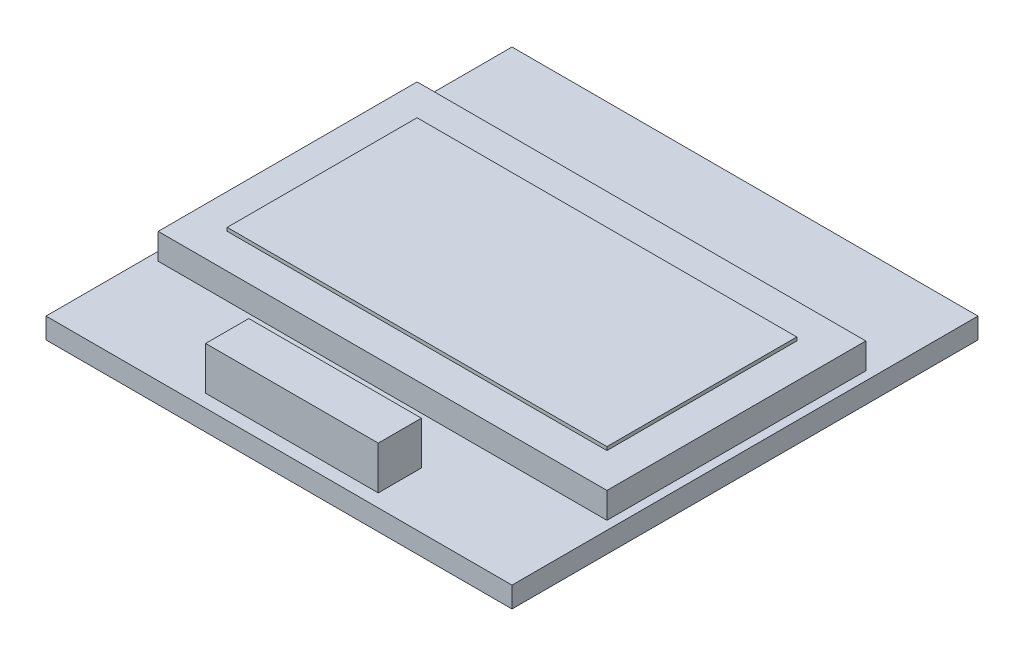
ISO-10303-21;
HEADER;
FILE_DESCRIPTION(('STEP AP214'),'2;1');
FILE_NAME('part.step','',(''),(''),'','','');
FILE_SCHEMA(('AUTOMOTIVE_DESIGN { 1 0 10303 214 1 1 1 1 }'));
ENDSEC;
DATA;
#1=APPLICATION_CONTEXT('core data for automotive mechanical design processes');
#2=APPLICATION_PROTOCOL_DEFINITION('international standard','automotive_design',2000,#1);
#3=PRODUCT_CONTEXT('',#1,'mechanical');
#4=PRODUCT('Part','Part','',(#3));
#5=PRODUCT_RELATED_PRODUCT_CATEGORY('part','',(#4));
#6=PRODUCT_DEFINITION_FORMATION('','',#4);
#7=PRODUCT_DEFINITION_CONTEXT('part definition',#1,'design');
#8=PRODUCT_DEFINITION('design','',#6,#7);
#9=PRODUCT_DEFINITION_SHAPE('','',#8);
#10=(LENGTH_UNIT() NAMED_UNIT(*) SI_UNIT(.MILLI.,.METRE.));
#11=(NAMED_UNIT(*) PLANE_ANGLE_UNIT() SI_UNIT($,.RADIAN.));
#12=(NAMED_UNIT(*) SI_UNIT($,.STERADIAN.) SOLID_ANGLE_UNIT());
#13=UNCERTAINTY_MEASURE_WITH_UNIT(LENGTH_MEASURE(1.E-05),#10,'distance_accuracy_value','');
#14=(GEOMETRIC_REPRESENTATION_CONTEXT(3) GLOBAL_UNCERTAINTY_ASSIGNED_CONTEXT((#13)) GLOBAL_UNIT_ASSIGNED_CONTEXT((#10,
#11,#12)) REPRESENTATION_CONTEXT('',''));
#15=CARTESIAN_POINT('',(0.,0.,0.));
#16=DIRECTION('',(0.,0.,1.));
#17=DIRECTION('',(1.,0.,0.));
#18=AXIS2_PLACEMENT_3D('',#15,#16,#17);
#19=CARTESIAN_POINT('',(0.,1.2,0.));
#20=DIRECTION('',(0.,-1.,0.));
#21=DIRECTION('',(0.,0.,-1.));
#22=AXIS2_PLACEMENT_3D('',#19,#20,#21);
#23=PLANE('',#22);
#24=DIRECTION('',(0.,0.,-1.));
#25=VECTOR('',#24,1.);
#26=CARTESIAN_POINT('',(13.,1.2,7.5));
#27=LINE('',#26,#25);
#28=CARTESIAN_POINT('',(13.,1.2,7.5));
#29=VERTEX_POINT('',#28);
#30=CARTESIAN_POINT('',(13.,1.2,-7.5));
#31=VERTEX_POINT('',#30);
#32=EDGE_CURVE('E236',#29,#31,#27,.T.);
#33=ORIENTED_EDGE('',*,*,#32,.F.);
#34=DIRECTION('',(1.,0.,0.));
#35=VECTOR('',#34,1.);
#36=CARTESIAN_POINT('',(-13.,1.2,7.5));
#37=LINE('',#36,#35);
#38=CARTESIAN_POINT('',(-13.,1.2,7.5));
#39=VERTEX_POINT('',#38);
#40=EDGE_CURVE('E245',#39,#29,#37,.T.);
#41=ORIENTED_EDGE('',*,*,#40,.F.);
#42=DIRECTION('',(0.,0.,1.));
#43=VECTOR('',#42,1.);
#44=CARTESIAN_POINT('',(-13.,1.2,7.5));
#45=LINE('',#44,#43);
#46=CARTESIAN_POINT('',(-13.,1.2,-7.5));
#47=VERTEX_POINT('',#46);
#48=EDGE_CURVE('E261',#47,#39,#45,.T.);
#49=ORIENTED_EDGE('',*,*,#48,.F.);
#50=DIRECTION('',(-1.,0.,0.));
#51=VECTOR('',#50,1.);
#52=CARTESIAN_POINT('',(-13.,1.2,-7.5));
#53=LINE('',#52,#51);
#54=EDGE_CURVE('E260',#31,#47,#53,.T.);
#55=ORIENTED_EDGE('',*,*,#54,.F.);
#56=EDGE_LOOP('',(#33,#41,#49,#55));
#57=FACE_BOUND('',#56,.T.);
#58=DIRECTION('',(0.,0.,-1.));
#59=VECTOR('',#58,1.);
#60=CARTESIAN_POINT('',(13.5,1.2,13.5));
#61=LINE('',#60,#59);
#62=CARTESIAN_POINT('',(13.5,1.2,13.5));
#63=VERTEX_POINT('',#62);
#64=CARTESIAN_POINT('',(13.5,1.2,-13.5));
#65=VERTEX_POINT('',#64);
#66=EDGE_CURVE('E285',#63,#65,#61,.T.);
#67=ORIENTED_EDGE('',*,*,#66,.T.);
#68=DIRECTION('',(-1.,0.,0.));
#69=VECTOR('',#68,1.);
#70=CARTESIAN_POINT('',(-13.5,1.2,-13.5));
#71=LINE('',#70,#69);
#72=CARTESIAN_POINT('',(-13.5,1.2,-13.5));
#73=VERTEX_POINT('',#72);
#74=EDGE_CURVE('E289',#65,#73,#71,.T.);
#75=ORIENTED_EDGE('',*,*,#74,.T.);
#76=DIRECTION('',(0.,0.,1.));
#77=VECTOR('',#76,1.);
#78=CARTESIAN_POINT('',(-13.5,1.2,13.5));
#79=LINE('',#78,#77);
#80=CARTESIAN_POINT('',(-13.5,1.2,13.5));
#81=VERTEX_POINT('',#80);
#82=EDGE_CURVE('E295',#73,#81,#79,.T.);
#83=ORIENTED_EDGE('',*,*,#82,.T.);
#84=DIRECTION('',(1.,0.,0.));
#85=VECTOR('',#84,1.);
#86=CARTESIAN_POINT('',(-13.5,1.2,13.5));
#87=LINE('',#86,#85);
#88=EDGE_CURVE('E293',#81,#63,#87,.T.);
#89=ORIENTED_EDGE('',*,*,#88,.T.);
#90=EDGE_LOOP('',(#67,#75,#83,#89));
#91=FACE_BOUND('',#90,.T.);
#92=DIRECTION('',(0.,0.,-1.));
#93=VECTOR('',#92,1.);
#94=CARTESIAN_POINT('',(5.,1.2,12.75));
#95=LINE('',#94,#93);
#96=CARTESIAN_POINT('',(5.,1.2,12.75));
#97=VERTEX_POINT('',#96);
#98=CARTESIAN_POINT('',(5.,1.2,10.25));
#99=VERTEX_POINT('',#98);
#100=EDGE_CURVE('E183',#97,#99,#95,.T.);
#101=ORIENTED_EDGE('',*,*,#100,.F.);
#102=DIRECTION('',(1.,0.,0.));
#103=VECTOR('',#102,1.);
#104=CARTESIAN_POINT('',(-5.,1.2,12.75));
#105=LINE('',#104,#103);
#106=CARTESIAN_POINT('',(-5.,1.2,12.75));
#107=VERTEX_POINT('',#106);
#108=EDGE_CURVE('E185',#107,#97,#105,.T.);
#109=ORIENTED_EDGE('',*,*,#108,.F.);
#110=DIRECTION('',(0.,0.,1.));
#111=VECTOR('',#110,1.);
#112=CARTESIAN_POINT('',(-5.,1.2,12.75));
#113=LINE('',#112,#111);
#114=CARTESIAN_POINT('',(-5.,1.2,10.25));
#115=VERTEX_POINT('',#114);
#116=EDGE_CURVE('E68',#115,#107,#113,.T.);
#117=ORIENTED_EDGE('',*,*,#116,.F.);
#118=DIRECTION('',(-1.,0.,0.));
#119=VECTOR('',#118,1.);
#120=CARTESIAN_POINT('',(-5.,1.2,10.25));
#121=LINE('',#120,#119);
#122=EDGE_CURVE('E61',#99,#115,#121,.T.);
#123=ORIENTED_EDGE('',*,*,#122,.F.);
#124=EDGE_LOOP('',(#101,#109,#117,#123));
#125=FACE_BOUND('',#124,.T.);
#126=ADVANCED_FACE('F47',(#57,#91,#125),#23,.F.);
#127=CARTESIAN_POINT('',(0.,2.7,0.));
#128=DIRECTION('',(0.,-1.,0.));
#129=DIRECTION('',(0.,0.,-1.));
#130=AXIS2_PLACEMENT_3D('',#127,#128,#129);
#131=PLANE('',#130);
#132=DIRECTION('',(0.,0.,-1.));
#133=VECTOR('',#132,1.);
#134=CARTESIAN_POINT('',(13.,2.7,7.5));
#135=LINE('',#134,#133);
#136=CARTESIAN_POINT('',(13.,2.7,7.5));
#137=VERTEX_POINT('',#136);
#138=CARTESIAN_POINT('',(13.,2.7,-7.5));
#139=VERTEX_POINT('',#138);
#140=EDGE_CURVE('E239',#137,#139,#135,.T.);
#141=ORIENTED_EDGE('',*,*,#140,.T.);
#142=DIRECTION('',(-1.,0.,0.));
#143=VECTOR('',#142,1.);
#144=CARTESIAN_POINT('',(-13.,2.7,-7.5));
#145=LINE('',#144,#143);
#146=CARTESIAN_POINT('',(-13.,2.7,-7.5));
#147=VERTEX_POINT('',#146);
#148=EDGE_CURVE('E242',#139,#147,#145,.T.);
#149=ORIENTED_EDGE('',*,*,#148,.T.);
#150=DIRECTION('',(0.,0.,1.));
#151=VECTOR('',#150,1.);
#152=CARTESIAN_POINT('',(-13.,2.7,7.5));
#153=LINE('',#152,#151);
#154=CARTESIAN_POINT('',(-13.,2.7,7.5));
#155=VERTEX_POINT('',#154);
#156=EDGE_CURVE('E250',#147,#155,#153,.T.);
#157=ORIENTED_EDGE('',*,*,#156,.T.);
#158=DIRECTION('',(1.,0.,0.));
#159=VECTOR('',#158,1.);
#160=CARTESIAN_POINT('',(-13.,2.7,7.5));
#161=LINE('',#160,#159);
#162=EDGE_CURVE('E248',#155,#137,#161,.T.);
#163=ORIENTED_EDGE('',*,*,#162,.T.);
#164=EDGE_LOOP('',(#141,#149,#157,#163));
#165=FACE_BOUND('',#164,.T.);
#166=DIRECTION('',(0.,0.,-1.));
#167=VECTOR('',#166,1.);
#168=CARTESIAN_POINT('',(11.,2.7,5.5));
#169=LINE('',#168,#167);
#170=CARTESIAN_POINT('',(11.,2.7,5.5));
#171=VERTEX_POINT('',#170);
#172=CARTESIAN_POINT('',(11.,2.7,-5.5));
#173=VERTEX_POINT('',#172);
#174=EDGE_CURVE('E189',#171,#173,#169,.T.);
#175=ORIENTED_EDGE('',*,*,#174,.F.);
#176=DIRECTION('',(1.,0.,0.));
#177=VECTOR('',#176,1.);
#178=CARTESIAN_POINT('',(-11.,2.7,5.5));
#179=LINE('',#178,#177);
#180=CARTESIAN_POINT('',(-11.,2.7,5.5));
#181=VERTEX_POINT('',#180);
#182=EDGE_CURVE('E201',#181,#171,#179,.T.);
#183=ORIENTED_EDGE('',*,*,#182,.F.);
#184=DIRECTION('',(0.,0.,1.));
#185=VECTOR('',#184,1.);
#186=CARTESIAN_POINT('',(-11.,2.7,5.5));
#187=LINE('',#186,#185);
#188=CARTESIAN_POINT('',(-11.,2.7,-5.5));
#189=VERTEX_POINT('',#188);
#190=EDGE_CURVE('E216',#189,#181,#187,.T.);
#191=ORIENTED_EDGE('',*,*,#190,.F.);
#192=DIRECTION('',(-1.,0.,0.));
#193=VECTOR('',#192,1.);
#194=CARTESIAN_POINT('',(-11.,2.7,-5.5));
#195=LINE('',#194,#193);
#196=EDGE_CURVE('E195',#173,#189,#195,.T.);
#197=ORIENTED_EDGE('',*,*,#196,.F.);
#198=EDGE_LOOP('',(#175,#183,#191,#197));
#199=FACE_BOUND('',#198,.T.);
#200=ADVANCED_FACE('F341',(#165,#199),#131,.F.);
#201=CARTESIAN_POINT('',(13.5,1.2,13.5));
#202=DIRECTION('',(-1.,0.,0.));
#203=DIRECTION('',(0.,0.,1.));
#204=AXIS2_PLACEMENT_3D('',#201,#202,#203);
#205=PLANE('',#204);
#206=DIRECTION('',(0.,0.,-1.));
#207=VECTOR('',#206,1.);
#208=CARTESIAN_POINT('',(13.5,0.,13.5));
#209=LINE('',#208,#207);
#210=CARTESIAN_POINT('',(13.5,0.,13.5));
#211=VERTEX_POINT('',#210);
#212=CARTESIAN_POINT('',(13.5,0.,-13.5));
#213=VERTEX_POINT('',#212);
#214=EDGE_CURVE('E282',#211,#213,#209,.T.);
#215=ORIENTED_EDGE('',*,*,#214,.T.);
#216=DIRECTION('',(0.,-1.,0.));
#217=VECTOR('',#216,1.);
#218=CARTESIAN_POINT('',(13.5,1.2,-13.5));
#219=LINE('',#218,#217);
#220=EDGE_CURVE('E11',#65,#213,#219,.T.);
#221=ORIENTED_EDGE('',*,*,#220,.F.);
#222=ORIENTED_EDGE('',*,*,#66,.F.);
#223=DIRECTION('',(0.,-1.,0.));
#224=VECTOR('',#223,1.);
#225=CARTESIAN_POINT('',(13.5,1.2,13.5));
#226=LINE('',#225,#224);
#227=EDGE_CURVE('E297',#63,#211,#226,.T.);
#228=ORIENTED_EDGE('',*,*,#227,.T.);
#229=EDGE_LOOP('',(#215,#221,#222,#228));
#230=FACE_BOUND('',#229,.T.);
#231=ADVANCED_FACE('F51',(#230),#205,.F.);
#232=CARTESIAN_POINT('',(-13.5,1.2,-13.5));
#233=DIRECTION('',(0.,0.,1.));
#234=DIRECTION('',(1.,0.,0.));
#235=AXIS2_PLACEMENT_3D('',#232,#233,#234);
#236=PLANE('',#235);
#237=DIRECTION('',(-1.,0.,0.));
#238=VECTOR('',#237,1.);
#239=CARTESIAN_POINT('',(-13.5,0.,-13.5));
#240=LINE('',#239,#238);
#241=CARTESIAN_POINT('',(-13.5,0.,-13.5));
#242=VERTEX_POINT('',#241);
#243=EDGE_CURVE('E305',#213,#242,#240,.T.);
#244=ORIENTED_EDGE('',*,*,#243,.T.);
#245=DIRECTION('',(0.,-1.,0.));
#246=VECTOR('',#245,1.);
#247=CARTESIAN_POINT('',(-13.5,1.2,-13.5));
#248=LINE('',#247,#246);
#249=EDGE_CURVE('E59',#73,#242,#248,.T.);
#250=ORIENTED_EDGE('',*,*,#249,.F.);
#251=ORIENTED_EDGE('',*,*,#74,.F.);
#252=ORIENTED_EDGE('',*,*,#220,.T.);
#253=EDGE_LOOP('',(#244,#250,#251,#252));
#254=FACE_BOUND('',#253,.T.);
#255=ADVANCED_FACE('F339',(#254),#236,.F.);
#256=CARTESIAN_POINT('',(-13.5,1.2,13.5));
#257=DIRECTION('',(1.,0.,0.));
#258=DIRECTION('',(0.,0.,-1.));
#259=AXIS2_PLACEMENT_3D('',#256,#257,#258);
#260=PLANE('',#259);
#261=DIRECTION('',(0.,0.,1.));
#262=VECTOR('',#261,1.);
#263=CARTESIAN_POINT('',(-13.5,0.,13.5));
#264=LINE('',#263,#262);
#265=CARTESIAN_POINT('',(-13.5,0.,13.5));
#266=VERTEX_POINT('',#265);
#267=EDGE_CURVE('E303',#242,#266,#264,.T.);
#268=ORIENTED_EDGE('',*,*,#267,.T.);
#269=DIRECTION('',(0.,-1.,0.));
#270=VECTOR('',#269,1.);
#271=CARTESIAN_POINT('',(-13.5,1.2,13.5));
#272=LINE('',#271,#270);
#273=EDGE_CURVE('E311',#81,#266,#272,.T.);
#274=ORIENTED_EDGE('',*,*,#273,.F.);
#275=ORIENTED_EDGE('',*,*,#82,.F.);
#276=ORIENTED_EDGE('',*,*,#249,.T.);
#277=EDGE_LOOP('',(#268,#274,#275,#276));
#278=FACE_BOUND('',#277,.T.);
#279=ADVANCED_FACE('F325',(#278),#260,.F.);
#280=CARTESIAN_POINT('',(-13.5,1.2,13.5));
#281=DIRECTION('',(0.,0.,-1.));
#282=DIRECTION('',(-1.,0.,0.));
#283=AXIS2_PLACEMENT_3D('',#280,#281,#282);
#284=PLANE('',#283);
#285=DIRECTION('',(1.,0.,0.));
#286=VECTOR('',#285,1.);
#287=CARTESIAN_POINT('',(-13.5,0.,13.5));
#288=LINE('',#287,#286);
#289=EDGE_CURVE('E286',#266,#211,#288,.T.);
#290=ORIENTED_EDGE('',*,*,#289,.T.);
#291=ORIENTED_EDGE('',*,*,#227,.F.);
#292=ORIENTED_EDGE('',*,*,#88,.F.);
#293=ORIENTED_EDGE('',*,*,#273,.T.);
#294=EDGE_LOOP('',(#290,#291,#292,#293));
#295=FACE_BOUND('',#294,.T.);
#296=ADVANCED_FACE('F332',(#295),#284,.F.);
#297=CARTESIAN_POINT('',(0.,0.,0.));
#298=DIRECTION('',(0.,-1.,0.));
#299=DIRECTION('',(0.,0.,-1.));
#300=AXIS2_PLACEMENT_3D('',#297,#298,#299);
#301=PLANE('',#300);
#302=ORIENTED_EDGE('',*,*,#214,.F.);
#303=ORIENTED_EDGE('',*,*,#289,.F.);
#304=ORIENTED_EDGE('',*,*,#267,.F.);
#305=ORIENTED_EDGE('',*,*,#243,.F.);
#306=EDGE_LOOP('',(#302,#303,#304,#305));
#307=FACE_BOUND('',#306,.T.);
#308=ADVANCED_FACE('F327',(#307),#301,.T.);
#309=CARTESIAN_POINT('',(13.,2.7,7.5));
#310=DIRECTION('',(-1.,0.,0.));
#311=DIRECTION('',(0.,0.,1.));
#312=AXIS2_PLACEMENT_3D('',#309,#310,#311);
#313=PLANE('',#312);
#314=ORIENTED_EDGE('',*,*,#32,.T.);
#315=DIRECTION('',(0.,-1.,0.));
#316=VECTOR('',#315,1.);
#317=CARTESIAN_POINT('',(13.,2.7,-7.5));
#318=LINE('',#317,#316);
#319=EDGE_CURVE('E276',#139,#31,#318,.T.);
#320=ORIENTED_EDGE('',*,*,#319,.F.);
#321=ORIENTED_EDGE('',*,*,#140,.F.);
#322=DIRECTION('',(0.,-1.,0.));
#323=VECTOR('',#322,1.);
#324=CARTESIAN_POINT('',(13.,2.7,7.5));
#325=LINE('',#324,#323);
#326=EDGE_CURVE('E251',#137,#29,#325,.T.);
#327=ORIENTED_EDGE('',*,*,#326,.T.);
#328=EDGE_LOOP('',(#314,#320,#321,#327));
#329=FACE_BOUND('',#328,.T.);
#330=ADVANCED_FACE('F360',(#329),#313,.F.);
#331=CARTESIAN_POINT('',(-13.,2.7,-7.5));
#332=DIRECTION('',(0.,0.,1.));
#333=DIRECTION('',(1.,0.,0.));
#334=AXIS2_PLACEMENT_3D('',#331,#332,#333);
#335=PLANE('',#334);
#336=ORIENTED_EDGE('',*,*,#54,.T.);
#337=DIRECTION('',(0.,-1.,0.));
#338=VECTOR('',#337,1.);
#339=CARTESIAN_POINT('',(-13.,2.7,-7.5));
#340=LINE('',#339,#338);
#341=EDGE_CURVE('E274',#147,#47,#340,.T.);
#342=ORIENTED_EDGE('',*,*,#341,.F.);
#343=ORIENTED_EDGE('',*,*,#148,.F.);
#344=ORIENTED_EDGE('',*,*,#319,.T.);
#345=EDGE_LOOP('',(#336,#342,#343,#344));
#346=FACE_BOUND('',#345,.T.);
#347=ADVANCED_FACE('F379',(#346),#335,.F.);
#348=CARTESIAN_POINT('',(-13.,2.7,7.5));
#349=DIRECTION('',(1.,0.,0.));
#350=DIRECTION('',(0.,0.,-1.));
#351=AXIS2_PLACEMENT_3D('',#348,#349,#350);
#352=PLANE('',#351);
#353=ORIENTED_EDGE('',*,*,#48,.T.);
#354=DIRECTION('',(0.,-1.,0.));
#355=VECTOR('',#354,1.);
#356=CARTESIAN_POINT('',(-13.,2.7,7.5));
#357=LINE('',#356,#355);
#358=EDGE_CURVE('E271',#155,#39,#357,.T.);
#359=ORIENTED_EDGE('',*,*,#358,.F.);
#360=ORIENTED_EDGE('',*,*,#156,.F.);
#361=ORIENTED_EDGE('',*,*,#341,.T.);
#362=EDGE_LOOP('',(#353,#359,#360,#361));
#363=FACE_BOUND('',#362,.T.);
#364=ADVANCED_FACE('F394',(#363),#352,.F.);
#365=CARTESIAN_POINT('',(-13.,2.7,7.5));
#366=DIRECTION('',(0.,0.,-1.));
#367=DIRECTION('',(-1.,0.,0.));
#368=AXIS2_PLACEMENT_3D('',#365,#366,#367);
#369=PLANE('',#368);
#370=ORIENTED_EDGE('',*,*,#40,.T.);
#371=ORIENTED_EDGE('',*,*,#326,.F.);
#372=ORIENTED_EDGE('',*,*,#162,.F.);
#373=ORIENTED_EDGE('',*,*,#358,.T.);
#374=EDGE_LOOP('',(#370,#371,#372,#373));
#375=FACE_BOUND('',#374,.T.);
#376=ADVANCED_FACE('F401',(#375),#369,.F.);
#377=CARTESIAN_POINT('',(11.,2.9,5.5));
#378=DIRECTION('',(-1.,0.,0.));
#379=DIRECTION('',(0.,0.,1.));
#380=AXIS2_PLACEMENT_3D('',#377,#378,#379);
#381=PLANE('',#380);
#382=ORIENTED_EDGE('',*,*,#174,.T.);
#383=DIRECTION('',(0.,-1.,0.));
#384=VECTOR('',#383,1.);
#385=CARTESIAN_POINT('',(11.,2.9,-5.5));
#386=LINE('',#385,#384);
#387=CARTESIAN_POINT('',(11.,2.9,-5.5));
#388=VERTEX_POINT('',#387);
#389=EDGE_CURVE('E231',#388,#173,#386,.T.);
#390=ORIENTED_EDGE('',*,*,#389,.F.);
#391=DIRECTION('',(0.,0.,-1.));
#392=VECTOR('',#391,1.);
#393=CARTESIAN_POINT('',(11.,2.9,5.5));
#394=LINE('',#393,#392);
#395=CARTESIAN_POINT('',(11.,2.9,5.5));
#396=VERTEX_POINT('',#395);
#397=EDGE_CURVE('E196',#396,#388,#394,.T.);
#398=ORIENTED_EDGE('',*,*,#397,.F.);
#399=DIRECTION('',(0.,-1.,0.));
#400=VECTOR('',#399,1.);
#401=CARTESIAN_POINT('',(11.,2.9,5.5));
#402=LINE('',#401,#400);
#403=EDGE_CURVE('E211',#396,#171,#402,.T.);
#404=ORIENTED_EDGE('',*,*,#403,.T.);
#405=EDGE_LOOP('',(#382,#390,#398,#404));
#406=FACE_BOUND('',#405,.T.);
#407=ADVANCED_FACE('F413',(#406),#381,.F.);
#408=CARTESIAN_POINT('',(-11.,2.9,-5.5));
#409=DIRECTION('',(0.,0.,1.));
#410=DIRECTION('',(1.,0.,0.));
#411=AXIS2_PLACEMENT_3D('',#408,#409,#410);
#412=PLANE('',#411);
#413=ORIENTED_EDGE('',*,*,#196,.T.);
#414=DIRECTION('',(0.,-1.,0.));
#415=VECTOR('',#414,1.);
#416=CARTESIAN_POINT('',(-11.,2.9,-5.5));
#417=LINE('',#416,#415);
#418=CARTESIAN_POINT('',(-11.,2.9,-5.5));
#419=VERTEX_POINT('',#418);
#420=EDGE_CURVE('E226',#419,#189,#417,.T.);
#421=ORIENTED_EDGE('',*,*,#420,.F.);
#422=DIRECTION('',(-1.,0.,0.));
#423=VECTOR('',#422,1.);
#424=CARTESIAN_POINT('',(-11.,2.9,-5.5));
#425=LINE('',#424,#423);
#426=EDGE_CURVE('E205',#388,#419,#425,.T.);
#427=ORIENTED_EDGE('',*,*,#426,.F.);
#428=ORIENTED_EDGE('',*,*,#389,.T.);
#429=EDGE_LOOP('',(#413,#421,#427,#428));
#430=FACE_BOUND('',#429,.T.);
#431=ADVANCED_FACE('F432',(#430),#412,.F.);
#432=CARTESIAN_POINT('',(-11.,2.9,5.5));
#433=DIRECTION('',(1.,0.,0.));
#434=DIRECTION('',(0.,0.,-1.));
#435=AXIS2_PLACEMENT_3D('',#432,#433,#434);
#436=PLANE('',#435);
#437=ORIENTED_EDGE('',*,*,#190,.T.);
#438=DIRECTION('',(0.,-1.,0.));
#439=VECTOR('',#438,1.);
#440=CARTESIAN_POINT('',(-11.,2.9,5.5));
#441=LINE('',#440,#439);
#442=CARTESIAN_POINT('',(-11.,2.9,5.5));
#443=VERTEX_POINT('',#442);
#444=EDGE_CURVE('E228',#443,#181,#441,.T.);
#445=ORIENTED_EDGE('',*,*,#444,.F.);
#446=DIRECTION('',(0.,0.,1.));
#447=VECTOR('',#446,1.);
#448=CARTESIAN_POINT('',(-11.,2.9,5.5));
#449=LINE('',#448,#447);
#450=EDGE_CURVE('E206',#419,#443,#449,.T.);
#451=ORIENTED_EDGE('',*,*,#450,.F.);
#452=ORIENTED_EDGE('',*,*,#420,.T.);
#453=EDGE_LOOP('',(#437,#445,#451,#452));
#454=FACE_BOUND('',#453,.T.);
#455=ADVANCED_FACE('F443',(#454),#436,.F.);
#456=CARTESIAN_POINT('',(-11.,2.9,5.5));
#457=DIRECTION('',(0.,0.,-1.));
#458=DIRECTION('',(-1.,0.,0.));
#459=AXIS2_PLACEMENT_3D('',#456,#457,#458);
#460=PLANE('',#459);
#461=ORIENTED_EDGE('',*,*,#182,.T.);
#462=ORIENTED_EDGE('',*,*,#403,.F.);
#463=DIRECTION('',(1.,0.,0.));
#464=VECTOR('',#463,1.);
#465=CARTESIAN_POINT('',(-11.,2.9,5.5));
#466=LINE('',#465,#464);
#467=EDGE_CURVE('E207',#443,#396,#466,.T.);
#468=ORIENTED_EDGE('',*,*,#467,.F.);
#469=ORIENTED_EDGE('',*,*,#444,.T.);
#470=EDGE_LOOP('',(#461,#462,#468,#469));
#471=FACE_BOUND('',#470,.T.);
#472=ADVANCED_FACE('F460',(#471),#460,.F.);
#473=CARTESIAN_POINT('',(0.,2.9,0.));
#474=DIRECTION('',(0.,-1.,0.));
#475=DIRECTION('',(0.,0.,-1.));
#476=AXIS2_PLACEMENT_3D('',#473,#474,#475);
#477=PLANE('',#476);
#478=ORIENTED_EDGE('',*,*,#397,.T.);
#479=ORIENTED_EDGE('',*,*,#426,.T.);
#480=ORIENTED_EDGE('',*,*,#450,.T.);
#481=ORIENTED_EDGE('',*,*,#467,.T.);
#482=EDGE_LOOP('',(#478,#479,#480,#481));
#483=FACE_BOUND('',#482,.T.);
#484=ADVANCED_FACE('F469',(#483),#477,.F.);
#485=CARTESIAN_POINT('',(5.,3.7,12.75));
#486=DIRECTION('',(-1.,0.,0.));
#487=DIRECTION('',(0.,0.,1.));
#488=AXIS2_PLACEMENT_3D('',#485,#486,#487);
#489=PLANE('',#488);
#490=ORIENTED_EDGE('',*,*,#100,.T.);
#491=DIRECTION('',(0.,-1.,0.));
#492=VECTOR('',#491,1.);
#493=CARTESIAN_POINT('',(5.,3.7,10.25));
#494=LINE('',#493,#492);
#495=CARTESIAN_POINT('',(5.,3.7,10.25));
#496=VERTEX_POINT('',#495);
#497=EDGE_CURVE('E163',#496,#99,#494,.T.);
#498=ORIENTED_EDGE('',*,*,#497,.F.);
#499=DIRECTION('',(0.,0.,-1.));
#500=VECTOR('',#499,1.);
#501=CARTESIAN_POINT('',(5.,3.7,12.75));
#502=LINE('',#501,#500);
#503=CARTESIAN_POINT('',(5.,3.7,12.75));
#504=VERTEX_POINT('',#503);
#505=EDGE_CURVE('E174',#504,#496,#502,.T.);
#506=ORIENTED_EDGE('',*,*,#505,.F.);
#507=DIRECTION('',(0.,-1.,0.));
#508=VECTOR('',#507,1.);
#509=CARTESIAN_POINT('',(5.,3.7,12.75));
#510=LINE('',#509,#508);
#511=EDGE_CURVE('E556',#504,#97,#510,.T.);
#512=ORIENTED_EDGE('',*,*,#511,.T.);
#513=EDGE_LOOP('',(#490,#498,#506,#512));
#514=FACE_BOUND('',#513,.T.);
#515=ADVANCED_FACE('F184',(#514),#489,.F.);
#516=CARTESIAN_POINT('',(-5.,3.7,10.25));
#517=DIRECTION('',(0.,0.,1.));
#518=DIRECTION('',(1.,0.,0.));
#519=AXIS2_PLACEMENT_3D('',#516,#517,#518);
#520=PLANE('',#519);
#521=ORIENTED_EDGE('',*,*,#122,.T.);
#522=DIRECTION('',(0.,-1.,0.));
#523=VECTOR('',#522,1.);
#524=CARTESIAN_POINT('',(-5.,3.7,10.25));
#525=LINE('',#524,#523);
#526=CARTESIAN_POINT('',(-5.,3.7,10.25));
#527=VERTEX_POINT('',#526);
#528=EDGE_CURVE('E170',#527,#115,#525,.T.);
#529=ORIENTED_EDGE('',*,*,#528,.F.);
#530=DIRECTION('',(-1.,0.,0.));
#531=VECTOR('',#530,1.);
#532=CARTESIAN_POINT('',(-5.,3.7,10.25));
#533=LINE('',#532,#531);
#534=EDGE_CURVE('E159',#496,#527,#533,.T.);
#535=ORIENTED_EDGE('',*,*,#534,.F.);
#536=ORIENTED_EDGE('',*,*,#497,.T.);
#537=EDGE_LOOP('',(#521,#529,#535,#536));
#538=FACE_BOUND('',#537,.T.);
#539=ADVANCED_FACE('F165',(#538),#520,.F.);
#540=CARTESIAN_POINT('',(-5.,3.7,12.75));
#541=DIRECTION('',(1.,0.,0.));
#542=DIRECTION('',(0.,0.,-1.));
#543=AXIS2_PLACEMENT_3D('',#540,#541,#542);
#544=PLANE('',#543);
#545=ORIENTED_EDGE('',*,*,#116,.T.);
#546=DIRECTION('',(0.,-1.,0.));
#547=VECTOR('',#546,1.);
#548=CARTESIAN_POINT('',(-5.,3.7,12.75));
#549=LINE('',#548,#547);
#550=CARTESIAN_POINT('',(-5.,3.7,12.75));
#551=VERTEX_POINT('',#550);
#552=EDGE_CURVE('E191',#551,#107,#549,.T.);
#553=ORIENTED_EDGE('',*,*,#552,.F.);
#554=DIRECTION('',(0.,0.,1.));
#555=VECTOR('',#554,1.);
#556=CARTESIAN_POINT('',(-5.,3.7,12.75));
#557=LINE('',#556,#555);
#558=EDGE_CURVE('E173',#527,#551,#557,.T.);
#559=ORIENTED_EDGE('',*,*,#558,.F.);
#560=ORIENTED_EDGE('',*,*,#528,.T.);
#561=EDGE_LOOP('',(#545,#553,#559,#560));
#562=FACE_BOUND('',#561,.T.);
#563=ADVANCED_FACE('F499',(#562),#544,.F.);
#564=CARTESIAN_POINT('',(-5.,3.7,12.75));
#565=DIRECTION('',(0.,0.,-1.));
#566=DIRECTION('',(-1.,0.,0.));
#567=AXIS2_PLACEMENT_3D('',#564,#565,#566);
#568=PLANE('',#567);
#569=ORIENTED_EDGE('',*,*,#108,.T.);
#570=ORIENTED_EDGE('',*,*,#511,.F.);
#571=DIRECTION('',(1.,0.,0.));
#572=VECTOR('',#571,1.);
#573=CARTESIAN_POINT('',(-5.,3.7,12.75));
#574=LINE('',#573,#572);
#575=EDGE_CURVE('E180',#551,#504,#574,.T.);
#576=ORIENTED_EDGE('',*,*,#575,.F.);
#577=ORIENTED_EDGE('',*,*,#552,.T.);
#578=EDGE_LOOP('',(#569,#570,#576,#577));
#579=FACE_BOUND('',#578,.T.);
#580=ADVANCED_FACE('F510',(#579),#568,.F.);
#581=CARTESIAN_POINT('',(0.,3.7,0.));
#582=DIRECTION('',(0.,-1.,0.));
#583=DIRECTION('',(0.,0.,-1.));
#584=AXIS2_PLACEMENT_3D('',#581,#582,#583);
#585=PLANE('',#584);
#586=ORIENTED_EDGE('',*,*,#505,.T.);
#587=ORIENTED_EDGE('',*,*,#534,.T.);
#588=ORIENTED_EDGE('',*,*,#558,.T.);
#589=ORIENTED_EDGE('',*,*,#575,.T.);
#590=EDGE_LOOP('',(#586,#587,#588,#589));
#591=FACE_BOUND('',#590,.T.);
#592=ADVANCED_FACE('F171',(#591),#585,.F.);
#593=CLOSED_SHELL('',(#126,#200,#231,#255,#279,#296,#308,#330,#347,#364,#376,#407,#431,#455,
#472,#484,#515,#539,#563,#580,#592));
#594=MANIFOLD_SOLID_BREP('B2',#593);
#595=ADVANCED_BREP_SHAPE_REPRESENTATION('',(#18,#594),#14);
#596=SHAPE_DEFINITION_REPRESENTATION(#9,#595);
ENDSEC;
END-ISO-10303-21;
